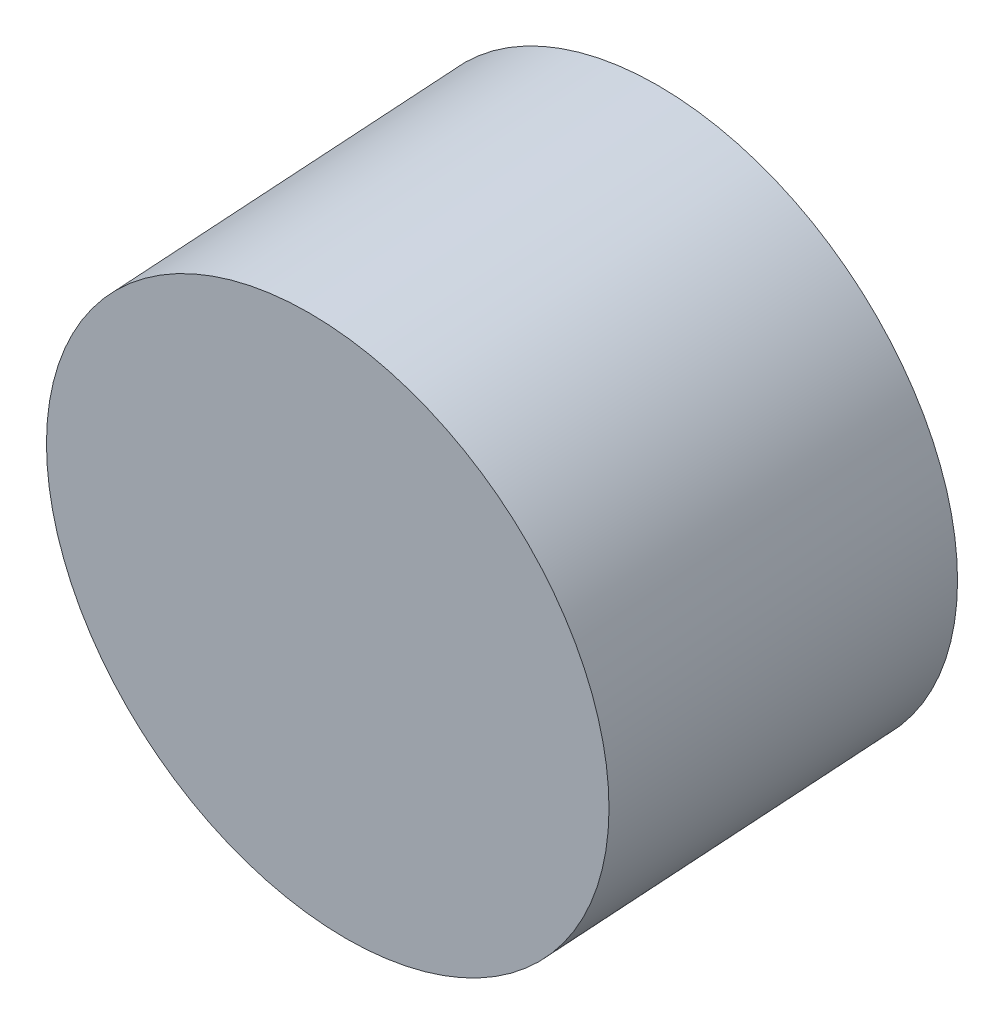
ISO-10303-21;
HEADER;
FILE_DESCRIPTION(('STEP AP214'),'2;1');
FILE_NAME('part.step','',(''),(''),'','','');
FILE_SCHEMA(('AUTOMOTIVE_DESIGN { 1 0 10303 214 1 1 1 1 }'));
ENDSEC;
DATA;
#1=APPLICATION_CONTEXT('core data for automotive mechanical design processes');
#2=APPLICATION_PROTOCOL_DEFINITION('international standard','automotive_design',2000,#1);
#3=PRODUCT_CONTEXT('',#1,'mechanical');
#4=PRODUCT('Part','Part','',(#3));
#5=PRODUCT_RELATED_PRODUCT_CATEGORY('part','',(#4));
#6=PRODUCT_DEFINITION_FORMATION('','',#4);
#7=PRODUCT_DEFINITION_CONTEXT('part definition',#1,'design');
#8=PRODUCT_DEFINITION('design','',#6,#7);
#9=PRODUCT_DEFINITION_SHAPE('','',#8);
#10=(LENGTH_UNIT() NAMED_UNIT(*) SI_UNIT(.MILLI.,.METRE.));
#11=(NAMED_UNIT(*) PLANE_ANGLE_UNIT() SI_UNIT($,.RADIAN.));
#12=(NAMED_UNIT(*) SI_UNIT($,.STERADIAN.) SOLID_ANGLE_UNIT());
#13=UNCERTAINTY_MEASURE_WITH_UNIT(LENGTH_MEASURE(1.E-05),#10,'distance_accuracy_value','');
#14=(GEOMETRIC_REPRESENTATION_CONTEXT(3) GLOBAL_UNCERTAINTY_ASSIGNED_CONTEXT((#13)) GLOBAL_UNIT_ASSIGNED_CONTEXT((#10,
#11,#12)) REPRESENTATION_CONTEXT('',''));
#15=CARTESIAN_POINT('',(0.,0.,0.));
#16=DIRECTION('',(0.,0.,1.));
#17=DIRECTION('',(1.,0.,0.));
#18=AXIS2_PLACEMENT_3D('',#15,#16,#17);
#19=CARTESIAN_POINT('',(2.5,27.2548157982068,2.34757658145803));
#20=DIRECTION('',(0.,0.0654031292301432,-0.997858923238603));
#21=DIRECTION('',(0.,0.997858923238603,0.0654031292301432));
#22=AXIS2_PLACEMENT_3D('',#19,#20,#21);
#23=CYLINDRICAL_SURFACE('',#22,0.9);
#24=CARTESIAN_POINT('',(2.5,27.2548157982068,2.34757658145803));
#25=DIRECTION('',(0.,-0.0654031292301432,0.997858923238603));
#26=DIRECTION('',(1.,0.,0.));
#27=AXIS2_PLACEMENT_3D('',#24,#25,#26);
#28=CIRCLE('',#27,0.9);
#29=CARTESIAN_POINT('',(3.4,27.2548157982068,2.34757658145803));
#30=VERTEX_POINT('',#29);
#31=EDGE_CURVE('E22',#30,#30,#28,.T.);
#32=ORIENTED_EDGE('',*,*,#31,.F.);
#33=EDGE_LOOP('',(#32));
#34=FACE_BOUND('',#33,.T.);
#35=CARTESIAN_POINT('',(2.5,27.3280673029446,1.22997458743079));
#36=DIRECTION('',(0.,-0.0654031292301432,0.997858923238603));
#37=DIRECTION('',(1.,0.,0.));
#38=AXIS2_PLACEMENT_3D('',#35,#36,#37);
#39=CIRCLE('',#38,0.9);
#40=CARTESIAN_POINT('',(3.4,27.3280673029446,1.22997458743079));
#41=VERTEX_POINT('',#40);
#42=EDGE_CURVE('E10',#41,#41,#39,.T.);
#43=ORIENTED_EDGE('',*,*,#42,.T.);
#44=EDGE_LOOP('',(#43));
#45=FACE_BOUND('',#44,.T.);
#46=ADVANCED_FACE('F15',(#34,#45),#23,.T.);
#47=CARTESIAN_POINT('',(2.5,27.2548157982068,2.34757658145803));
#48=DIRECTION('',(0.,-0.0654031292301432,0.997858923238604));
#49=DIRECTION('',(0.,-0.997858923238604,-0.0654031292301432));
#50=AXIS2_PLACEMENT_3D('',#47,#48,#49);
#51=PLANE('',#50);
#52=ORIENTED_EDGE('',*,*,#31,.T.);
#53=EDGE_LOOP('',(#52));
#54=FACE_BOUND('',#53,.T.);
#55=ADVANCED_FACE('F28',(#54),#51,.T.);
#56=CARTESIAN_POINT('',(2.5,27.3280673029446,1.22997458743079));
#57=DIRECTION('',(0.,-0.0654031292301432,0.997858923238604));
#58=DIRECTION('',(0.,-0.997858923238604,-0.0654031292301432));
#59=AXIS2_PLACEMENT_3D('',#56,#57,#58);
#60=PLANE('',#59);
#61=ORIENTED_EDGE('',*,*,#42,.F.);
#62=EDGE_LOOP('',(#61));
#63=FACE_BOUND('',#62,.T.);
#64=ADVANCED_FACE('F17',(#63),#60,.F.);
#65=CLOSED_SHELL('',(#46,#55,#64));
#66=MANIFOLD_SOLID_BREP('B1',#65);
#67=ADVANCED_BREP_SHAPE_REPRESENTATION('',(#18,#66),#14);
#68=SHAPE_DEFINITION_REPRESENTATION(#9,#67);
ENDSEC;
END-ISO-10303-21;
